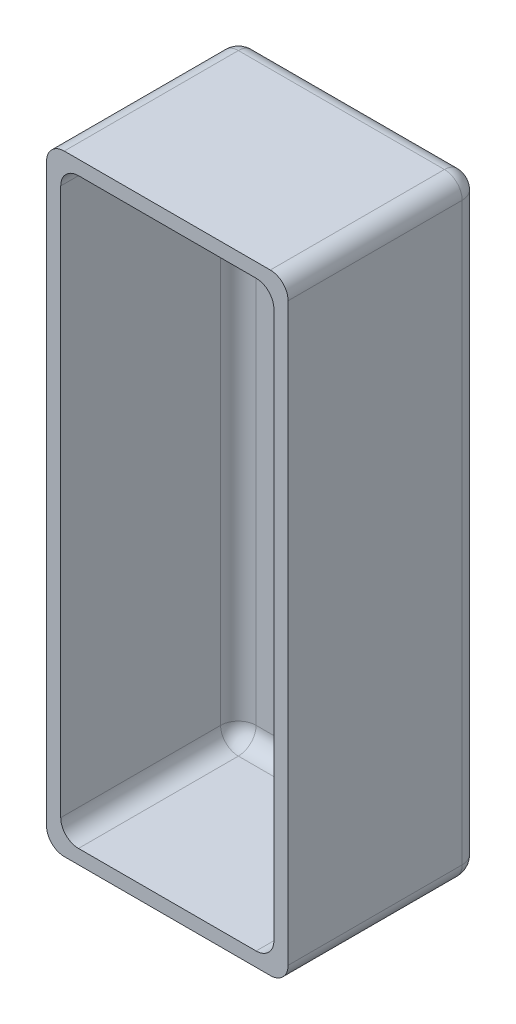
ISO-10303-21;
HEADER;
FILE_DESCRIPTION(('STEP AP214'),'2;1');
FILE_NAME('part.step','',(''),(''),'','','');
FILE_SCHEMA(('AUTOMOTIVE_DESIGN { 1 0 10303 214 1 1 1 1 }'));
ENDSEC;
DATA;
#1=APPLICATION_CONTEXT('core data for automotive mechanical design processes');
#2=APPLICATION_PROTOCOL_DEFINITION('international standard','automotive_design',2000,#1);
#3=PRODUCT_CONTEXT('',#1,'mechanical');
#4=PRODUCT('Part','Part','',(#3));
#5=PRODUCT_RELATED_PRODUCT_CATEGORY('part','',(#4));
#6=PRODUCT_DEFINITION_FORMATION('','',#4);
#7=PRODUCT_DEFINITION_CONTEXT('part definition',#1,'design');
#8=PRODUCT_DEFINITION('design','',#6,#7);
#9=PRODUCT_DEFINITION_SHAPE('','',#8);
#10=(LENGTH_UNIT() NAMED_UNIT(*) SI_UNIT(.MILLI.,.METRE.));
#11=(NAMED_UNIT(*) PLANE_ANGLE_UNIT() SI_UNIT($,.RADIAN.));
#12=(NAMED_UNIT(*) SI_UNIT($,.STERADIAN.) SOLID_ANGLE_UNIT());
#13=UNCERTAINTY_MEASURE_WITH_UNIT(LENGTH_MEASURE(1.E-05),#10,'distance_accuracy_value','');
#14=(GEOMETRIC_REPRESENTATION_CONTEXT(3) GLOBAL_UNCERTAINTY_ASSIGNED_CONTEXT((#13)) GLOBAL_UNIT_ASSIGNED_CONTEXT((#10,
#11,#12)) REPRESENTATION_CONTEXT('',''));
#15=CARTESIAN_POINT('',(0.,0.,0.));
#16=DIRECTION('',(0.,0.,1.));
#17=DIRECTION('',(1.,0.,0.));
#18=AXIS2_PLACEMENT_3D('',#15,#16,#17);
#19=CARTESIAN_POINT('',(-17.,-41.,25.));
#20=DIRECTION('',(1.,0.,0.));
#21=DIRECTION('',(0.,0.,-1.));
#22=AXIS2_PLACEMENT_3D('',#19,#20,#21);
#23=PLANE('',#22);
#24=DIRECTION('',(0.,-1.,0.));
#25=VECTOR('',#24,1.);
#26=CARTESIAN_POINT('',(-17.,-41.,25.));
#27=LINE('',#26,#25);
#28=CARTESIAN_POINT('',(-17.,40.5,25.));
#29=VERTEX_POINT('',#28);
#30=CARTESIAN_POINT('',(-17.,-40.5,25.));
#31=VERTEX_POINT('',#30);
#32=EDGE_CURVE('E297',#29,#31,#27,.T.);
#33=ORIENTED_EDGE('',*,*,#32,.F.);
#34=DIRECTION('',(0.,0.,-1.));
#35=VECTOR('',#34,1.);
#36=CARTESIAN_POINT('',(-17.,40.5,25.));
#37=LINE('',#36,#35);
#38=CARTESIAN_POINT('',(-17.,40.5,0.5));
#39=VERTEX_POINT('',#38);
#40=EDGE_CURVE('E304',#29,#39,#37,.T.);
#41=ORIENTED_EDGE('',*,*,#40,.T.);
#42=DIRECTION('',(0.,-1.,0.));
#43=VECTOR('',#42,1.);
#44=CARTESIAN_POINT('',(-17.,-41.,0.5));
#45=LINE('',#44,#43);
#46=CARTESIAN_POINT('',(-17.,-40.5,0.5));
#47=VERTEX_POINT('',#46);
#48=EDGE_CURVE('E314',#39,#47,#45,.T.);
#49=ORIENTED_EDGE('',*,*,#48,.T.);
#50=DIRECTION('',(0.,0.,-1.));
#51=VECTOR('',#50,1.);
#52=CARTESIAN_POINT('',(-17.,-40.5,25.));
#53=LINE('',#52,#51);
#54=EDGE_CURVE('E307',#47,#31,#53,.F.);
#55=ORIENTED_EDGE('',*,*,#54,.T.);
#56=EDGE_LOOP('',(#33,#41,#49,#55));
#57=FACE_BOUND('',#56,.T.);
#58=ADVANCED_FACE('F33',(#57),#23,.F.);
#59=CARTESIAN_POINT('',(15.,-43.,25.));
#60=DIRECTION('',(0.,1.,0.));
#61=DIRECTION('',(-1.,0.,0.));
#62=AXIS2_PLACEMENT_3D('',#59,#60,#61);
#63=PLANE('',#62);
#64=DIRECTION('',(1.,0.,0.));
#65=VECTOR('',#64,1.);
#66=CARTESIAN_POINT('',(15.,-43.,25.));
#67=LINE('',#66,#65);
#68=CARTESIAN_POINT('',(-14.5,-43.,25.));
#69=VERTEX_POINT('',#68);
#70=CARTESIAN_POINT('',(14.5,-43.,25.));
#71=VERTEX_POINT('',#70);
#72=EDGE_CURVE('E308',#69,#71,#67,.T.);
#73=ORIENTED_EDGE('',*,*,#72,.F.);
#74=DIRECTION('',(0.,0.,-1.));
#75=VECTOR('',#74,1.);
#76=CARTESIAN_POINT('',(-14.5,-43.,25.));
#77=LINE('',#76,#75);
#78=CARTESIAN_POINT('',(-14.5,-43.,0.5));
#79=VERTEX_POINT('',#78);
#80=EDGE_CURVE('E283',#69,#79,#77,.T.);
#81=ORIENTED_EDGE('',*,*,#80,.T.);
#82=DIRECTION('',(1.,0.,0.));
#83=VECTOR('',#82,1.);
#84=CARTESIAN_POINT('',(15.,-43.,0.5));
#85=LINE('',#84,#83);
#86=CARTESIAN_POINT('',(14.5,-43.,0.5));
#87=VERTEX_POINT('',#86);
#88=EDGE_CURVE('E316',#79,#87,#85,.T.);
#89=ORIENTED_EDGE('',*,*,#88,.T.);
#90=DIRECTION('',(0.,0.,-1.));
#91=VECTOR('',#90,1.);
#92=CARTESIAN_POINT('',(14.5,-43.,25.));
#93=LINE('',#92,#91);
#94=EDGE_CURVE('E313',#87,#71,#93,.F.);
#95=ORIENTED_EDGE('',*,*,#94,.T.);
#96=EDGE_LOOP('',(#73,#81,#89,#95));
#97=FACE_BOUND('',#96,.T.);
#98=ADVANCED_FACE('F324',(#97),#63,.F.);
#99=CARTESIAN_POINT('',(17.,-41.,25.));
#100=DIRECTION('',(-1.,0.,0.));
#101=DIRECTION('',(0.,0.,1.));
#102=AXIS2_PLACEMENT_3D('',#99,#100,#101);
#103=PLANE('',#102);
#104=DIRECTION('',(0.,1.,0.));
#105=VECTOR('',#104,1.);
#106=CARTESIAN_POINT('',(17.,-41.,0.5));
#107=LINE('',#106,#105);
#108=CARTESIAN_POINT('',(17.,-40.5,0.5));
#109=VERTEX_POINT('',#108);
#110=CARTESIAN_POINT('',(17.,40.5,0.5));
#111=VERTEX_POINT('',#110);
#112=EDGE_CURVE('E50',#109,#111,#107,.T.);
#113=ORIENTED_EDGE('',*,*,#112,.T.);
#114=DIRECTION('',(0.,0.,-1.));
#115=VECTOR('',#114,1.);
#116=CARTESIAN_POINT('',(17.,40.5,25.));
#117=LINE('',#116,#115);
#118=CARTESIAN_POINT('',(17.,40.5,25.));
#119=VERTEX_POINT('',#118);
#120=EDGE_CURVE('E279',#111,#119,#117,.F.);
#121=ORIENTED_EDGE('',*,*,#120,.T.);
#122=DIRECTION('',(0.,1.,0.));
#123=VECTOR('',#122,1.);
#124=CARTESIAN_POINT('',(17.,-41.,25.));
#125=LINE('',#124,#123);
#126=CARTESIAN_POINT('',(17.,-40.5,25.));
#127=VERTEX_POINT('',#126);
#128=EDGE_CURVE('E386',#127,#119,#125,.T.);
#129=ORIENTED_EDGE('',*,*,#128,.F.);
#130=DIRECTION('',(0.,0.,-1.));
#131=VECTOR('',#130,1.);
#132=CARTESIAN_POINT('',(17.,-40.5,25.));
#133=LINE('',#132,#131);
#134=EDGE_CURVE('E55',#127,#109,#133,.T.);
#135=ORIENTED_EDGE('',*,*,#134,.T.);
#136=EDGE_LOOP('',(#113,#121,#129,#135));
#137=FACE_BOUND('',#136,.T.);
#138=ADVANCED_FACE('F463',(#137),#103,.F.);
#139=CARTESIAN_POINT('',(15.,43.,25.));
#140=DIRECTION('',(0.,-1.,0.));
#141=DIRECTION('',(1.,0.,0.));
#142=AXIS2_PLACEMENT_3D('',#139,#140,#141);
#143=PLANE('',#142);
#144=DIRECTION('',(-1.,0.,0.));
#145=VECTOR('',#144,1.);
#146=CARTESIAN_POINT('',(15.,43.,0.5));
#147=LINE('',#146,#145);
#148=CARTESIAN_POINT('',(14.5,43.,0.5));
#149=VERTEX_POINT('',#148);
#150=CARTESIAN_POINT('',(-14.5,43.,0.5));
#151=VERTEX_POINT('',#150);
#152=EDGE_CURVE('E351',#149,#151,#147,.T.);
#153=ORIENTED_EDGE('',*,*,#152,.T.);
#154=DIRECTION('',(0.,0.,-1.));
#155=VECTOR('',#154,1.);
#156=CARTESIAN_POINT('',(-14.5,43.,25.));
#157=LINE('',#156,#155);
#158=CARTESIAN_POINT('',(-14.5,43.,25.));
#159=VERTEX_POINT('',#158);
#160=EDGE_CURVE('E349',#151,#159,#157,.F.);
#161=ORIENTED_EDGE('',*,*,#160,.T.);
#162=DIRECTION('',(-1.,0.,0.));
#163=VECTOR('',#162,1.);
#164=CARTESIAN_POINT('',(15.,43.,25.));
#165=LINE('',#164,#163);
#166=CARTESIAN_POINT('',(14.5,43.,25.));
#167=VERTEX_POINT('',#166);
#168=EDGE_CURVE('E183',#167,#159,#165,.T.);
#169=ORIENTED_EDGE('',*,*,#168,.F.);
#170=DIRECTION('',(0.,0.,-1.));
#171=VECTOR('',#170,1.);
#172=CARTESIAN_POINT('',(14.5,43.,25.));
#173=LINE('',#172,#171);
#174=EDGE_CURVE('E354',#167,#149,#173,.T.);
#175=ORIENTED_EDGE('',*,*,#174,.T.);
#176=EDGE_LOOP('',(#153,#161,#169,#175));
#177=FACE_BOUND('',#176,.T.);
#178=ADVANCED_FACE('F470',(#177),#143,.F.);
#179=CARTESIAN_POINT('',(0.,0.,25.));
#180=DIRECTION('',(0.,0.,1.));
#181=DIRECTION('',(1.,0.,0.));
#182=AXIS2_PLACEMENT_3D('',#179,#180,#181);
#183=PLANE('',#182);
#184=DIRECTION('',(0.,-1.,0.));
#185=VECTOR('',#184,1.);
#186=CARTESIAN_POINT('',(-15.,-41.,25.));
#187=LINE('',#186,#185);
#188=CARTESIAN_POINT('',(-15.,38.5,25.));
#189=VERTEX_POINT('',#188);
#190=CARTESIAN_POINT('',(-15.,-38.5,25.));
#191=VERTEX_POINT('',#190);
#192=EDGE_CURVE('E175',#189,#191,#187,.T.);
#193=ORIENTED_EDGE('',*,*,#192,.F.);
#194=CARTESIAN_POINT('',(-12.5,38.5,25.));
#195=DIRECTION('',(0.,0.,1.));
#196=DIRECTION('',(1.,0.,0.));
#197=AXIS2_PLACEMENT_3D('',#194,#195,#196);
#198=CIRCLE('',#197,2.5);
#199=CARTESIAN_POINT('',(-12.5,41.,25.));
#200=VERTEX_POINT('',#199);
#201=EDGE_CURVE('E42',#189,#200,#198,.F.);
#202=ORIENTED_EDGE('',*,*,#201,.T.);
#203=DIRECTION('',(-1.,0.,0.));
#204=VECTOR('',#203,1.);
#205=CARTESIAN_POINT('',(15.,41.,25.));
#206=LINE('',#205,#204);
#207=CARTESIAN_POINT('',(12.5,41.,25.));
#208=VERTEX_POINT('',#207);
#209=EDGE_CURVE('E309',#208,#200,#206,.T.);
#210=ORIENTED_EDGE('',*,*,#209,.F.);
#211=CARTESIAN_POINT('',(12.5,38.5,25.));
#212=DIRECTION('',(0.,0.,1.));
#213=DIRECTION('',(1.,0.,0.));
#214=AXIS2_PLACEMENT_3D('',#211,#212,#213);
#215=CIRCLE('',#214,2.5);
#216=CARTESIAN_POINT('',(15.,38.5,25.));
#217=VERTEX_POINT('',#216);
#218=EDGE_CURVE('E11',#208,#217,#215,.F.);
#219=ORIENTED_EDGE('',*,*,#218,.T.);
#220=DIRECTION('',(0.,1.,0.));
#221=VECTOR('',#220,1.);
#222=CARTESIAN_POINT('',(15.,-41.,25.));
#223=LINE('',#222,#221);
#224=CARTESIAN_POINT('',(15.,-38.5,25.));
#225=VERTEX_POINT('',#224);
#226=EDGE_CURVE('E391',#225,#217,#223,.T.);
#227=ORIENTED_EDGE('',*,*,#226,.F.);
#228=CARTESIAN_POINT('',(12.5,-38.5,25.));
#229=DIRECTION('',(0.,0.,1.));
#230=DIRECTION('',(1.,0.,0.));
#231=AXIS2_PLACEMENT_3D('',#228,#229,#230);
#232=CIRCLE('',#231,2.5);
#233=CARTESIAN_POINT('',(12.5,-41.,25.));
#234=VERTEX_POINT('',#233);
#235=EDGE_CURVE('E199',#225,#234,#232,.F.);
#236=ORIENTED_EDGE('',*,*,#235,.T.);
#237=DIRECTION('',(1.,0.,0.));
#238=VECTOR('',#237,1.);
#239=CARTESIAN_POINT('',(15.,-41.,25.));
#240=LINE('',#239,#238);
#241=CARTESIAN_POINT('',(-12.5,-41.,25.));
#242=VERTEX_POINT('',#241);
#243=EDGE_CURVE('E193',#242,#234,#240,.T.);
#244=ORIENTED_EDGE('',*,*,#243,.F.);
#245=CARTESIAN_POINT('',(-12.5,-38.5,25.));
#246=DIRECTION('',(0.,0.,1.));
#247=DIRECTION('',(1.,0.,0.));
#248=AXIS2_PLACEMENT_3D('',#245,#246,#247);
#249=CIRCLE('',#248,2.5);
#250=EDGE_CURVE('E192',#242,#191,#249,.F.);
#251=ORIENTED_EDGE('',*,*,#250,.T.);
#252=EDGE_LOOP('',(#193,#202,#210,#219,#227,#236,#244,#251));
#253=FACE_BOUND('',#252,.T.);
#254=ORIENTED_EDGE('',*,*,#168,.T.);
#255=CARTESIAN_POINT('',(-14.5,40.5,25.));
#256=DIRECTION('',(0.,0.,1.));
#257=DIRECTION('',(1.,0.,0.));
#258=AXIS2_PLACEMENT_3D('',#255,#256,#257);
#259=CIRCLE('',#258,2.5);
#260=EDGE_CURVE('E292',#159,#29,#259,.T.);
#261=ORIENTED_EDGE('',*,*,#260,.T.);
#262=ORIENTED_EDGE('',*,*,#32,.T.);
#263=CARTESIAN_POINT('',(-14.5,-40.5,25.));
#264=DIRECTION('',(0.,0.,1.));
#265=DIRECTION('',(1.,0.,0.));
#266=AXIS2_PLACEMENT_3D('',#263,#264,#265);
#267=CIRCLE('',#266,2.5);
#268=EDGE_CURVE('E288',#31,#69,#267,.T.);
#269=ORIENTED_EDGE('',*,*,#268,.T.);
#270=ORIENTED_EDGE('',*,*,#72,.T.);
#271=CARTESIAN_POINT('',(14.5,-40.5,25.));
#272=DIRECTION('',(0.,0.,1.));
#273=DIRECTION('',(1.,0.,0.));
#274=AXIS2_PLACEMENT_3D('',#271,#272,#273);
#275=CIRCLE('',#274,2.5);
#276=EDGE_CURVE('E281',#71,#127,#275,.T.);
#277=ORIENTED_EDGE('',*,*,#276,.T.);
#278=ORIENTED_EDGE('',*,*,#128,.T.);
#279=CARTESIAN_POINT('',(14.5,40.5,25.));
#280=DIRECTION('',(0.,0.,1.));
#281=DIRECTION('',(1.,0.,0.));
#282=AXIS2_PLACEMENT_3D('',#279,#280,#281);
#283=CIRCLE('',#282,2.5);
#284=EDGE_CURVE('E290',#119,#167,#283,.T.);
#285=ORIENTED_EDGE('',*,*,#284,.T.);
#286=EDGE_LOOP('',(#254,#261,#262,#269,#270,#277,#278,#285));
#287=FACE_BOUND('',#286,.T.);
#288=ADVANCED_FACE('F186',(#253,#287),#183,.T.);
#289=CARTESIAN_POINT('',(0.,0.,-2.));
#290=DIRECTION('',(0.,0.,1.));
#291=DIRECTION('',(1.,0.,0.));
#292=AXIS2_PLACEMENT_3D('',#289,#290,#291);
#293=PLANE('',#292);
#294=DIRECTION('',(0.,-1.,0.));
#295=VECTOR('',#294,1.);
#296=CARTESIAN_POINT('',(-14.5,0.,-2.));
#297=LINE('',#296,#295);
#298=CARTESIAN_POINT('',(-14.5,-40.5,-2.));
#299=VERTEX_POINT('',#298);
#300=CARTESIAN_POINT('',(-14.5,40.5,-2.));
#301=VERTEX_POINT('',#300);
#302=EDGE_CURVE('E338',#299,#301,#297,.F.);
#303=ORIENTED_EDGE('',*,*,#302,.T.);
#304=DIRECTION('',(-1.,0.,0.));
#305=VECTOR('',#304,1.);
#306=CARTESIAN_POINT('',(0.,40.5,-2.));
#307=LINE('',#306,#305);
#308=CARTESIAN_POINT('',(14.5,40.5,-2.));
#309=VERTEX_POINT('',#308);
#310=EDGE_CURVE('E342',#301,#309,#307,.F.);
#311=ORIENTED_EDGE('',*,*,#310,.T.);
#312=DIRECTION('',(0.,1.,0.));
#313=VECTOR('',#312,1.);
#314=CARTESIAN_POINT('',(14.5,0.,-2.));
#315=LINE('',#314,#313);
#316=CARTESIAN_POINT('',(14.5,-40.5,-2.));
#317=VERTEX_POINT('',#316);
#318=EDGE_CURVE('E277',#309,#317,#315,.F.);
#319=ORIENTED_EDGE('',*,*,#318,.T.);
#320=DIRECTION('',(1.,0.,0.));
#321=VECTOR('',#320,1.);
#322=CARTESIAN_POINT('',(0.,-40.5,-2.));
#323=LINE('',#322,#321);
#324=EDGE_CURVE('E343',#317,#299,#323,.F.);
#325=ORIENTED_EDGE('',*,*,#324,.T.);
#326=EDGE_LOOP('',(#303,#311,#319,#325));
#327=FACE_BOUND('',#326,.T.);
#328=ADVANCED_FACE('F474',(#327),#293,.F.);
#329=CARTESIAN_POINT('',(-15.,-41.,25.));
#330=DIRECTION('',(1.,0.,0.));
#331=DIRECTION('',(0.,0.,-1.));
#332=AXIS2_PLACEMENT_3D('',#329,#330,#331);
#333=PLANE('',#332);
#334=ORIENTED_EDGE('',*,*,#192,.T.);
#335=DIRECTION('',(0.,0.,-1.));
#336=VECTOR('',#335,1.);
#337=CARTESIAN_POINT('',(-15.,-38.5,0.));
#338=LINE('',#337,#336);
#339=CARTESIAN_POINT('',(-15.,-38.5,2.5));
#340=VERTEX_POINT('',#339);
#341=EDGE_CURVE('E382',#191,#340,#338,.T.);
#342=ORIENTED_EDGE('',*,*,#341,.T.);
#343=DIRECTION('',(0.,-1.,0.));
#344=VECTOR('',#343,1.);
#345=CARTESIAN_POINT('',(-15.,41.,2.5));
#346=LINE('',#345,#344);
#347=CARTESIAN_POINT('',(-15.,38.5,2.5));
#348=VERTEX_POINT('',#347);
#349=EDGE_CURVE('E178',#340,#348,#346,.F.);
#350=ORIENTED_EDGE('',*,*,#349,.T.);
#351=DIRECTION('',(0.,0.,-1.));
#352=VECTOR('',#351,1.);
#353=CARTESIAN_POINT('',(-15.,38.5,25.));
#354=LINE('',#353,#352);
#355=EDGE_CURVE('E171',#348,#189,#354,.F.);
#356=ORIENTED_EDGE('',*,*,#355,.T.);
#357=EDGE_LOOP('',(#334,#342,#350,#356));
#358=FACE_BOUND('',#357,.T.);
#359=ADVANCED_FACE('F173',(#358),#333,.T.);
#360=CARTESIAN_POINT('',(15.,-41.,25.));
#361=DIRECTION('',(0.,1.,0.));
#362=DIRECTION('',(-1.,0.,0.));
#363=AXIS2_PLACEMENT_3D('',#360,#361,#362);
#364=PLANE('',#363);
#365=DIRECTION('',(1.,0.,0.));
#366=VECTOR('',#365,1.);
#367=CARTESIAN_POINT('',(-15.,-41.,2.5));
#368=LINE('',#367,#366);
#369=CARTESIAN_POINT('',(12.5,-41.,2.5));
#370=VERTEX_POINT('',#369);
#371=CARTESIAN_POINT('',(-12.5,-41.,2.5));
#372=VERTEX_POINT('',#371);
#373=EDGE_CURVE('E378',#370,#372,#368,.F.);
#374=ORIENTED_EDGE('',*,*,#373,.T.);
#375=DIRECTION('',(0.,0.,-1.));
#376=VECTOR('',#375,1.);
#377=CARTESIAN_POINT('',(-12.5,-41.,25.));
#378=LINE('',#377,#376);
#379=EDGE_CURVE('E376',#372,#242,#378,.F.);
#380=ORIENTED_EDGE('',*,*,#379,.T.);
#381=ORIENTED_EDGE('',*,*,#243,.T.);
#382=DIRECTION('',(0.,0.,-1.));
#383=VECTOR('',#382,1.);
#384=CARTESIAN_POINT('',(12.5,-41.,0.));
#385=LINE('',#384,#383);
#386=EDGE_CURVE('E380',#234,#370,#385,.T.);
#387=ORIENTED_EDGE('',*,*,#386,.T.);
#388=EDGE_LOOP('',(#374,#380,#381,#387));
#389=FACE_BOUND('',#388,.T.);
#390=ADVANCED_FACE('F397',(#389),#364,.T.);
#391=CARTESIAN_POINT('',(15.,-41.,25.));
#392=DIRECTION('',(-1.,0.,0.));
#393=DIRECTION('',(0.,0.,1.));
#394=AXIS2_PLACEMENT_3D('',#391,#392,#393);
#395=PLANE('',#394);
#396=DIRECTION('',(0.,1.,0.));
#397=VECTOR('',#396,1.);
#398=CARTESIAN_POINT('',(15.,-41.,2.5));
#399=LINE('',#398,#397);
#400=CARTESIAN_POINT('',(15.,38.5,2.5));
#401=VERTEX_POINT('',#400);
#402=CARTESIAN_POINT('',(15.,-38.5,2.5));
#403=VERTEX_POINT('',#402);
#404=EDGE_CURVE('E363',#401,#403,#399,.F.);
#405=ORIENTED_EDGE('',*,*,#404,.T.);
#406=DIRECTION('',(0.,0.,-1.));
#407=VECTOR('',#406,1.);
#408=CARTESIAN_POINT('',(15.,-38.5,25.));
#409=LINE('',#408,#407);
#410=EDGE_CURVE('E361',#403,#225,#409,.F.);
#411=ORIENTED_EDGE('',*,*,#410,.T.);
#412=ORIENTED_EDGE('',*,*,#226,.T.);
#413=DIRECTION('',(0.,0.,-1.));
#414=VECTOR('',#413,1.);
#415=CARTESIAN_POINT('',(15.,38.5,0.));
#416=LINE('',#415,#414);
#417=EDGE_CURVE('E365',#217,#401,#416,.T.);
#418=ORIENTED_EDGE('',*,*,#417,.T.);
#419=EDGE_LOOP('',(#405,#411,#412,#418));
#420=FACE_BOUND('',#419,.T.);
#421=ADVANCED_FACE('F447',(#420),#395,.T.);
#422=CARTESIAN_POINT('',(15.,41.,25.));
#423=DIRECTION('',(0.,-1.,0.));
#424=DIRECTION('',(1.,0.,0.));
#425=AXIS2_PLACEMENT_3D('',#422,#423,#424);
#426=PLANE('',#425);
#427=ORIENTED_EDGE('',*,*,#209,.T.);
#428=DIRECTION('',(0.,0.,-1.));
#429=VECTOR('',#428,1.);
#430=CARTESIAN_POINT('',(-12.5,41.,0.));
#431=LINE('',#430,#429);
#432=CARTESIAN_POINT('',(-12.5,41.,2.5));
#433=VERTEX_POINT('',#432);
#434=EDGE_CURVE('E198',#200,#433,#431,.T.);
#435=ORIENTED_EDGE('',*,*,#434,.T.);
#436=DIRECTION('',(-1.,0.,0.));
#437=VECTOR('',#436,1.);
#438=CARTESIAN_POINT('',(15.,41.,2.5));
#439=LINE('',#438,#437);
#440=CARTESIAN_POINT('',(12.5,41.,2.5));
#441=VERTEX_POINT('',#440);
#442=EDGE_CURVE('E357',#433,#441,#439,.F.);
#443=ORIENTED_EDGE('',*,*,#442,.T.);
#444=DIRECTION('',(0.,0.,-1.));
#445=VECTOR('',#444,1.);
#446=CARTESIAN_POINT('',(12.5,41.,25.));
#447=LINE('',#446,#445);
#448=EDGE_CURVE('E359',#441,#208,#447,.F.);
#449=ORIENTED_EDGE('',*,*,#448,.T.);
#450=EDGE_LOOP('',(#427,#435,#443,#449));
#451=FACE_BOUND('',#450,.T.);
#452=ADVANCED_FACE('F434',(#451),#426,.T.);
#453=CARTESIAN_POINT('',(0.,0.,0.));
#454=DIRECTION('',(0.,0.,1.));
#455=DIRECTION('',(1.,0.,0.));
#456=AXIS2_PLACEMENT_3D('',#453,#454,#455);
#457=PLANE('',#456);
#458=DIRECTION('',(0.,-1.,0.));
#459=VECTOR('',#458,1.);
#460=CARTESIAN_POINT('',(-12.5,-41.,0.));
#461=LINE('',#460,#459);
#462=CARTESIAN_POINT('',(-12.5,38.5,0.));
#463=VERTEX_POINT('',#462);
#464=CARTESIAN_POINT('',(-12.5,-38.5,0.));
#465=VERTEX_POINT('',#464);
#466=EDGE_CURVE('E370',#463,#465,#461,.T.);
#467=ORIENTED_EDGE('',*,*,#466,.T.);
#468=DIRECTION('',(1.,0.,0.));
#469=VECTOR('',#468,1.);
#470=CARTESIAN_POINT('',(15.,-38.5,0.));
#471=LINE('',#470,#469);
#472=CARTESIAN_POINT('',(12.5,-38.5,0.));
#473=VERTEX_POINT('',#472);
#474=EDGE_CURVE('E367',#465,#473,#471,.T.);
#475=ORIENTED_EDGE('',*,*,#474,.T.);
#476=DIRECTION('',(0.,1.,0.));
#477=VECTOR('',#476,1.);
#478=CARTESIAN_POINT('',(12.5,41.,0.));
#479=LINE('',#478,#477);
#480=CARTESIAN_POINT('',(12.5,38.5,0.));
#481=VERTEX_POINT('',#480);
#482=EDGE_CURVE('E372',#473,#481,#479,.T.);
#483=ORIENTED_EDGE('',*,*,#482,.T.);
#484=DIRECTION('',(-1.,0.,0.));
#485=VECTOR('',#484,1.);
#486=CARTESIAN_POINT('',(-15.,38.5,0.));
#487=LINE('',#486,#485);
#488=EDGE_CURVE('E374',#481,#463,#487,.T.);
#489=ORIENTED_EDGE('',*,*,#488,.T.);
#490=EDGE_LOOP('',(#467,#475,#483,#489));
#491=FACE_BOUND('',#490,.T.);
#492=ADVANCED_FACE('F455',(#491),#457,.T.);
#493=CARTESIAN_POINT('',(12.5,38.5,25.));
#494=DIRECTION('',(0.,0.,1.));
#495=DIRECTION('',(1.,0.,0.));
#496=AXIS2_PLACEMENT_3D('',#493,#494,#495);
#497=CYLINDRICAL_SURFACE('',#496,2.5);
#498=CARTESIAN_POINT('',(12.5,38.5,2.5));
#499=DIRECTION('',(0.,0.,1.));
#500=DIRECTION('',(1.,0.,0.));
#501=AXIS2_PLACEMENT_3D('',#498,#499,#500);
#502=CIRCLE('',#501,2.5);
#503=EDGE_CURVE('E194',#401,#441,#502,.T.);
#504=ORIENTED_EDGE('',*,*,#503,.F.);
#505=ORIENTED_EDGE('',*,*,#417,.F.);
#506=ORIENTED_EDGE('',*,*,#218,.F.);
#507=ORIENTED_EDGE('',*,*,#448,.F.);
#508=EDGE_LOOP('',(#504,#505,#506,#507));
#509=FACE_BOUND('',#508,.T.);
#510=ADVANCED_FACE('F438',(#509),#497,.F.);
#511=CARTESIAN_POINT('',(12.5,38.5,2.5));
#512=DIRECTION('',(0.,0.,1.));
#513=DIRECTION('',(1.,0.,0.));
#514=AXIS2_PLACEMENT_3D('',#511,#512,#513);
#515=SPHERICAL_SURFACE('',#514,2.5);
#516=CARTESIAN_POINT('',(12.5,38.5,2.5));
#517=DIRECTION('',(0.,-1.,0.));
#518=DIRECTION('',(1.,0.,0.));
#519=AXIS2_PLACEMENT_3D('',#516,#517,#518);
#520=CIRCLE('',#519,2.5);
#521=EDGE_CURVE('E228',#401,#481,#520,.F.);
#522=ORIENTED_EDGE('',*,*,#521,.F.);
#523=ORIENTED_EDGE('',*,*,#503,.T.);
#524=CARTESIAN_POINT('',(12.5,38.5,2.5));
#525=DIRECTION('',(-1.,0.,0.));
#526=DIRECTION('',(0.,0.,1.));
#527=AXIS2_PLACEMENT_3D('',#524,#525,#526);
#528=CIRCLE('',#527,2.5);
#529=EDGE_CURVE('E231',#481,#441,#528,.F.);
#530=ORIENTED_EDGE('',*,*,#529,.F.);
#531=EDGE_LOOP('',(#522,#523,#530));
#532=FACE_BOUND('',#531,.T.);
#533=ADVANCED_FACE('F442',(#532),#515,.F.);
#534=CARTESIAN_POINT('',(-12.5,38.5,25.));
#535=DIRECTION('',(0.,0.,1.));
#536=DIRECTION('',(1.,0.,0.));
#537=AXIS2_PLACEMENT_3D('',#534,#535,#536);
#538=CYLINDRICAL_SURFACE('',#537,2.5);
#539=ORIENTED_EDGE('',*,*,#201,.F.);
#540=ORIENTED_EDGE('',*,*,#355,.F.);
#541=CARTESIAN_POINT('',(-12.5,38.5,2.5));
#542=DIRECTION('',(0.,0.,1.));
#543=DIRECTION('',(1.,0.,0.));
#544=AXIS2_PLACEMENT_3D('',#541,#542,#543);
#545=CIRCLE('',#544,2.5);
#546=EDGE_CURVE('E226',#433,#348,#545,.T.);
#547=ORIENTED_EDGE('',*,*,#546,.F.);
#548=ORIENTED_EDGE('',*,*,#434,.F.);
#549=EDGE_LOOP('',(#539,#540,#547,#548));
#550=FACE_BOUND('',#549,.T.);
#551=ADVANCED_FACE('F197',(#550),#538,.F.);
#552=CARTESIAN_POINT('',(0.,38.5,2.5));
#553=DIRECTION('',(1.,0.,0.));
#554=DIRECTION('',(0.,1.,0.));
#555=AXIS2_PLACEMENT_3D('',#552,#553,#554);
#556=CYLINDRICAL_SURFACE('',#555,2.5);
#557=ORIENTED_EDGE('',*,*,#529,.T.);
#558=ORIENTED_EDGE('',*,*,#442,.F.);
#559=CARTESIAN_POINT('',(-12.5,38.5,2.5));
#560=DIRECTION('',(1.,0.,0.));
#561=DIRECTION('',(0.,1.,0.));
#562=AXIS2_PLACEMENT_3D('',#559,#560,#561);
#563=CIRCLE('',#562,2.5);
#564=EDGE_CURVE('E223',#463,#433,#563,.T.);
#565=ORIENTED_EDGE('',*,*,#564,.F.);
#566=ORIENTED_EDGE('',*,*,#488,.F.);
#567=EDGE_LOOP('',(#557,#558,#565,#566));
#568=FACE_BOUND('',#567,.T.);
#569=ADVANCED_FACE('F430',(#568),#556,.F.);
#570=CARTESIAN_POINT('',(12.5,0.,2.5));
#571=DIRECTION('',(0.,-1.,0.));
#572=DIRECTION('',(0.,0.,-1.));
#573=AXIS2_PLACEMENT_3D('',#570,#571,#572);
#574=CYLINDRICAL_SURFACE('',#573,2.5);
#575=ORIENTED_EDGE('',*,*,#521,.T.);
#576=ORIENTED_EDGE('',*,*,#482,.F.);
#577=CARTESIAN_POINT('',(12.5,-38.5,2.5));
#578=DIRECTION('',(0.,1.,0.));
#579=DIRECTION('',(0.,0.,1.));
#580=AXIS2_PLACEMENT_3D('',#577,#578,#579);
#581=CIRCLE('',#580,2.5);
#582=EDGE_CURVE('E220',#403,#473,#581,.T.);
#583=ORIENTED_EDGE('',*,*,#582,.F.);
#584=ORIENTED_EDGE('',*,*,#404,.F.);
#585=EDGE_LOOP('',(#575,#576,#583,#584));
#586=FACE_BOUND('',#585,.T.);
#587=ADVANCED_FACE('F445',(#586),#574,.F.);
#588=CARTESIAN_POINT('',(12.5,-38.5,25.));
#589=DIRECTION('',(0.,0.,1.));
#590=DIRECTION('',(1.,0.,0.));
#591=AXIS2_PLACEMENT_3D('',#588,#589,#590);
#592=CYLINDRICAL_SURFACE('',#591,2.5);
#593=ORIENTED_EDGE('',*,*,#235,.F.);
#594=ORIENTED_EDGE('',*,*,#410,.F.);
#595=CARTESIAN_POINT('',(12.5,-38.5,2.5));
#596=DIRECTION('',(0.,0.,1.));
#597=DIRECTION('',(1.,0.,0.));
#598=AXIS2_PLACEMENT_3D('',#595,#596,#597);
#599=CIRCLE('',#598,2.5);
#600=EDGE_CURVE('E217',#370,#403,#599,.T.);
#601=ORIENTED_EDGE('',*,*,#600,.F.);
#602=ORIENTED_EDGE('',*,*,#386,.F.);
#603=EDGE_LOOP('',(#593,#594,#601,#602));
#604=FACE_BOUND('',#603,.T.);
#605=ADVANCED_FACE('F402',(#604),#592,.F.);
#606=CARTESIAN_POINT('',(-12.5,38.5,2.5));
#607=DIRECTION('',(0.,0.,1.));
#608=DIRECTION('',(1.,0.,0.));
#609=AXIS2_PLACEMENT_3D('',#606,#607,#608);
#610=SPHERICAL_SURFACE('',#609,2.5);
#611=ORIENTED_EDGE('',*,*,#564,.T.);
#612=ORIENTED_EDGE('',*,*,#546,.T.);
#613=CARTESIAN_POINT('',(-12.5,38.5,2.5));
#614=DIRECTION('',(0.,-1.,0.));
#615=DIRECTION('',(0.,0.,-1.));
#616=AXIS2_PLACEMENT_3D('',#613,#614,#615);
#617=CIRCLE('',#616,2.5);
#618=EDGE_CURVE('E214',#463,#348,#617,.F.);
#619=ORIENTED_EDGE('',*,*,#618,.F.);
#620=EDGE_LOOP('',(#611,#612,#619));
#621=FACE_BOUND('',#620,.T.);
#622=ADVANCED_FACE('F425',(#621),#610,.F.);
#623=CARTESIAN_POINT('',(12.5,-38.5,2.5));
#624=DIRECTION('',(0.,0.,1.));
#625=DIRECTION('',(1.,0.,0.));
#626=AXIS2_PLACEMENT_3D('',#623,#624,#625);
#627=SPHERICAL_SURFACE('',#626,2.5);
#628=ORIENTED_EDGE('',*,*,#600,.T.);
#629=ORIENTED_EDGE('',*,*,#582,.T.);
#630=CARTESIAN_POINT('',(12.5,-38.5,2.5));
#631=DIRECTION('',(-1.,0.,0.));
#632=DIRECTION('',(0.,0.,1.));
#633=AXIS2_PLACEMENT_3D('',#630,#631,#632);
#634=CIRCLE('',#633,2.5);
#635=EDGE_CURVE('E212',#370,#473,#634,.F.);
#636=ORIENTED_EDGE('',*,*,#635,.F.);
#637=EDGE_LOOP('',(#628,#629,#636));
#638=FACE_BOUND('',#637,.T.);
#639=ADVANCED_FACE('F408',(#638),#627,.F.);
#640=CARTESIAN_POINT('',(-12.5,0.,2.5));
#641=DIRECTION('',(0.,1.,0.));
#642=DIRECTION('',(0.,0.,1.));
#643=AXIS2_PLACEMENT_3D('',#640,#641,#642);
#644=CYLINDRICAL_SURFACE('',#643,2.5);
#645=ORIENTED_EDGE('',*,*,#618,.T.);
#646=ORIENTED_EDGE('',*,*,#349,.F.);
#647=CARTESIAN_POINT('',(-12.5,-38.5,2.5));
#648=DIRECTION('',(0.,1.,0.));
#649=DIRECTION('',(0.,0.,1.));
#650=AXIS2_PLACEMENT_3D('',#647,#648,#649);
#651=CIRCLE('',#650,2.5);
#652=EDGE_CURVE('E209',#465,#340,#651,.T.);
#653=ORIENTED_EDGE('',*,*,#652,.F.);
#654=ORIENTED_EDGE('',*,*,#466,.F.);
#655=EDGE_LOOP('',(#645,#646,#653,#654));
#656=FACE_BOUND('',#655,.T.);
#657=ADVANCED_FACE('F422',(#656),#644,.F.);
#658=CARTESIAN_POINT('',(0.,-38.5,2.5));
#659=DIRECTION('',(-1.,0.,0.));
#660=DIRECTION('',(0.,-1.,0.));
#661=AXIS2_PLACEMENT_3D('',#658,#659,#660);
#662=CYLINDRICAL_SURFACE('',#661,2.5);
#663=ORIENTED_EDGE('',*,*,#635,.T.);
#664=ORIENTED_EDGE('',*,*,#474,.F.);
#665=CARTESIAN_POINT('',(-12.5,-38.5,2.5));
#666=DIRECTION('',(1.,0.,0.));
#667=DIRECTION('',(0.,0.,-1.));
#668=AXIS2_PLACEMENT_3D('',#665,#666,#667);
#669=CIRCLE('',#668,2.5);
#670=EDGE_CURVE('E206',#372,#465,#669,.T.);
#671=ORIENTED_EDGE('',*,*,#670,.F.);
#672=ORIENTED_EDGE('',*,*,#373,.F.);
#673=EDGE_LOOP('',(#663,#664,#671,#672));
#674=FACE_BOUND('',#673,.T.);
#675=ADVANCED_FACE('F413',(#674),#662,.F.);
#676=CARTESIAN_POINT('',(-12.5,-38.5,2.5));
#677=DIRECTION('',(0.,0.,1.));
#678=DIRECTION('',(1.,0.,0.));
#679=AXIS2_PLACEMENT_3D('',#676,#677,#678);
#680=SPHERICAL_SURFACE('',#679,2.5);
#681=ORIENTED_EDGE('',*,*,#670,.T.);
#682=ORIENTED_EDGE('',*,*,#652,.T.);
#683=CARTESIAN_POINT('',(-12.5,-38.5,2.5));
#684=DIRECTION('',(0.,0.,1.));
#685=DIRECTION('',(1.,0.,0.));
#686=AXIS2_PLACEMENT_3D('',#683,#684,#685);
#687=CIRCLE('',#686,2.5);
#688=EDGE_CURVE('E204',#372,#340,#687,.F.);
#689=ORIENTED_EDGE('',*,*,#688,.F.);
#690=EDGE_LOOP('',(#681,#682,#689));
#691=FACE_BOUND('',#690,.T.);
#692=ADVANCED_FACE('F419',(#691),#680,.F.);
#693=CARTESIAN_POINT('',(-12.5,-38.5,25.));
#694=DIRECTION('',(0.,0.,1.));
#695=DIRECTION('',(1.,0.,0.));
#696=AXIS2_PLACEMENT_3D('',#693,#694,#695);
#697=CYLINDRICAL_SURFACE('',#696,2.5);
#698=ORIENTED_EDGE('',*,*,#250,.F.);
#699=ORIENTED_EDGE('',*,*,#379,.F.);
#700=ORIENTED_EDGE('',*,*,#688,.T.);
#701=ORIENTED_EDGE('',*,*,#341,.F.);
#702=EDGE_LOOP('',(#698,#699,#700,#701));
#703=FACE_BOUND('',#702,.T.);
#704=ADVANCED_FACE('F418',(#703),#697,.F.);
#705=CARTESIAN_POINT('',(14.5,-40.5,25.));
#706=DIRECTION('',(0.,0.,-1.));
#707=DIRECTION('',(-1.,0.,0.));
#708=AXIS2_PLACEMENT_3D('',#705,#706,#707);
#709=CYLINDRICAL_SURFACE('',#708,2.5);
#710=ORIENTED_EDGE('',*,*,#276,.F.);
#711=ORIENTED_EDGE('',*,*,#94,.F.);
#712=CARTESIAN_POINT('',(14.5,-40.5,0.5));
#713=DIRECTION('',(0.,0.,-1.));
#714=DIRECTION('',(-1.,0.,0.));
#715=AXIS2_PLACEMENT_3D('',#712,#713,#714);
#716=CIRCLE('',#715,2.5);
#717=EDGE_CURVE('E263',#109,#87,#716,.T.);
#718=ORIENTED_EDGE('',*,*,#717,.F.);
#719=ORIENTED_EDGE('',*,*,#134,.F.);
#720=EDGE_LOOP('',(#710,#711,#718,#719));
#721=FACE_BOUND('',#720,.T.);
#722=ADVANCED_FACE('F35',(#721),#709,.T.);
#723=CARTESIAN_POINT('',(-14.5,-40.5,25.));
#724=DIRECTION('',(0.,0.,-1.));
#725=DIRECTION('',(-1.,0.,0.));
#726=AXIS2_PLACEMENT_3D('',#723,#724,#725);
#727=CYLINDRICAL_SURFACE('',#726,2.5);
#728=ORIENTED_EDGE('',*,*,#268,.F.);
#729=ORIENTED_EDGE('',*,*,#54,.F.);
#730=CARTESIAN_POINT('',(-14.5,-40.5,0.5));
#731=DIRECTION('',(0.,0.,-1.));
#732=DIRECTION('',(-1.,0.,0.));
#733=AXIS2_PLACEMENT_3D('',#730,#731,#732);
#734=CIRCLE('',#733,2.5);
#735=EDGE_CURVE('E261',#79,#47,#734,.T.);
#736=ORIENTED_EDGE('',*,*,#735,.F.);
#737=ORIENTED_EDGE('',*,*,#80,.F.);
#738=EDGE_LOOP('',(#728,#729,#736,#737));
#739=FACE_BOUND('',#738,.T.);
#740=ADVANCED_FACE('F332',(#739),#727,.T.);
#741=CARTESIAN_POINT('',(15.,-40.5,0.5));
#742=DIRECTION('',(1.,0.,0.));
#743=DIRECTION('',(0.,1.,0.));
#744=AXIS2_PLACEMENT_3D('',#741,#742,#743);
#745=CYLINDRICAL_SURFACE('',#744,2.5);
#746=CARTESIAN_POINT('',(14.5,-40.5,0.5));
#747=DIRECTION('',(1.,0.,0.));
#748=DIRECTION('',(0.,0.,-1.));
#749=AXIS2_PLACEMENT_3D('',#746,#747,#748);
#750=CIRCLE('',#749,2.5);
#751=EDGE_CURVE('E37',#87,#317,#750,.T.);
#752=ORIENTED_EDGE('',*,*,#751,.F.);
#753=ORIENTED_EDGE('',*,*,#88,.F.);
#754=CARTESIAN_POINT('',(-14.5,-40.5,0.5));
#755=DIRECTION('',(-1.,0.,0.));
#756=DIRECTION('',(0.,0.,1.));
#757=AXIS2_PLACEMENT_3D('',#754,#755,#756);
#758=CIRCLE('',#757,2.5);
#759=EDGE_CURVE('E258',#299,#79,#758,.T.);
#760=ORIENTED_EDGE('',*,*,#759,.F.);
#761=ORIENTED_EDGE('',*,*,#324,.F.);
#762=EDGE_LOOP('',(#752,#753,#760,#761));
#763=FACE_BOUND('',#762,.T.);
#764=ADVANCED_FACE('F330',(#763),#745,.T.);
#765=CARTESIAN_POINT('',(14.5,-40.5,0.5));
#766=DIRECTION('',(0.,0.,1.));
#767=DIRECTION('',(1.,0.,0.));
#768=AXIS2_PLACEMENT_3D('',#765,#766,#767);
#769=SPHERICAL_SURFACE('',#768,2.5);
#770=ORIENTED_EDGE('',*,*,#717,.T.);
#771=ORIENTED_EDGE('',*,*,#751,.T.);
#772=CARTESIAN_POINT('',(14.5,-40.5,0.5));
#773=DIRECTION('',(0.,-1.,0.));
#774=DIRECTION('',(0.,0.,-1.));
#775=AXIS2_PLACEMENT_3D('',#772,#773,#774);
#776=CIRCLE('',#775,2.5);
#777=EDGE_CURVE('E255',#109,#317,#776,.F.);
#778=ORIENTED_EDGE('',*,*,#777,.F.);
#779=EDGE_LOOP('',(#770,#771,#778));
#780=FACE_BOUND('',#779,.T.);
#781=ADVANCED_FACE('F269',(#780),#769,.T.);
#782=CARTESIAN_POINT('',(-14.5,-40.5,0.5));
#783=DIRECTION('',(0.,0.,1.));
#784=DIRECTION('',(1.,0.,0.));
#785=AXIS2_PLACEMENT_3D('',#782,#783,#784);
#786=SPHERICAL_SURFACE('',#785,2.5);
#787=ORIENTED_EDGE('',*,*,#759,.T.);
#788=ORIENTED_EDGE('',*,*,#735,.T.);
#789=CARTESIAN_POINT('',(-14.5,-40.5,0.5));
#790=DIRECTION('',(0.,-1.,0.));
#791=DIRECTION('',(0.,0.,-1.));
#792=AXIS2_PLACEMENT_3D('',#789,#790,#791);
#793=CIRCLE('',#792,2.5);
#794=EDGE_CURVE('E252',#299,#47,#793,.F.);
#795=ORIENTED_EDGE('',*,*,#794,.F.);
#796=EDGE_LOOP('',(#787,#788,#795));
#797=FACE_BOUND('',#796,.T.);
#798=ADVANCED_FACE('F334',(#797),#786,.T.);
#799=CARTESIAN_POINT('',(14.5,-41.,0.5));
#800=DIRECTION('',(0.,1.,0.));
#801=DIRECTION('',(0.,0.,1.));
#802=AXIS2_PLACEMENT_3D('',#799,#800,#801);
#803=CYLINDRICAL_SURFACE('',#802,2.5);
#804=ORIENTED_EDGE('',*,*,#777,.T.);
#805=ORIENTED_EDGE('',*,*,#318,.F.);
#806=CARTESIAN_POINT('',(14.5,40.5,0.5));
#807=DIRECTION('',(0.,1.,0.));
#808=DIRECTION('',(0.,0.,1.));
#809=AXIS2_PLACEMENT_3D('',#806,#807,#808);
#810=CIRCLE('',#809,2.5);
#811=EDGE_CURVE('E249',#111,#309,#810,.T.);
#812=ORIENTED_EDGE('',*,*,#811,.F.);
#813=ORIENTED_EDGE('',*,*,#112,.F.);
#814=EDGE_LOOP('',(#804,#805,#812,#813));
#815=FACE_BOUND('',#814,.T.);
#816=ADVANCED_FACE('F275',(#815),#803,.T.);
#817=CARTESIAN_POINT('',(14.5,40.5,25.));
#818=DIRECTION('',(0.,0.,-1.));
#819=DIRECTION('',(-1.,0.,0.));
#820=AXIS2_PLACEMENT_3D('',#817,#818,#819);
#821=CYLINDRICAL_SURFACE('',#820,2.5);
#822=ORIENTED_EDGE('',*,*,#284,.F.);
#823=ORIENTED_EDGE('',*,*,#120,.F.);
#824=CARTESIAN_POINT('',(14.5,40.5,0.5));
#825=DIRECTION('',(0.,0.,-1.));
#826=DIRECTION('',(-1.,0.,0.));
#827=AXIS2_PLACEMENT_3D('',#824,#825,#826);
#828=CIRCLE('',#827,2.5);
#829=EDGE_CURVE('E246',#149,#111,#828,.T.);
#830=ORIENTED_EDGE('',*,*,#829,.F.);
#831=ORIENTED_EDGE('',*,*,#174,.F.);
#832=EDGE_LOOP('',(#822,#823,#830,#831));
#833=FACE_BOUND('',#832,.T.);
#834=ADVANCED_FACE('F517',(#833),#821,.T.);
#835=CARTESIAN_POINT('',(-14.5,40.5,25.));
#836=DIRECTION('',(0.,0.,-1.));
#837=DIRECTION('',(-1.,0.,0.));
#838=AXIS2_PLACEMENT_3D('',#835,#836,#837);
#839=CYLINDRICAL_SURFACE('',#838,2.5);
#840=ORIENTED_EDGE('',*,*,#260,.F.);
#841=ORIENTED_EDGE('',*,*,#160,.F.);
#842=CARTESIAN_POINT('',(-14.5,40.5,0.5));
#843=DIRECTION('',(0.,0.,-1.));
#844=DIRECTION('',(-1.,0.,0.));
#845=AXIS2_PLACEMENT_3D('',#842,#843,#844);
#846=CIRCLE('',#845,2.5);
#847=EDGE_CURVE('E243',#39,#151,#846,.T.);
#848=ORIENTED_EDGE('',*,*,#847,.F.);
#849=ORIENTED_EDGE('',*,*,#40,.F.);
#850=EDGE_LOOP('',(#840,#841,#848,#849));
#851=FACE_BOUND('',#850,.T.);
#852=ADVANCED_FACE('F312',(#851),#839,.T.);
#853=CARTESIAN_POINT('',(-14.5,-41.,0.5));
#854=DIRECTION('',(0.,-1.,0.));
#855=DIRECTION('',(0.,0.,-1.));
#856=AXIS2_PLACEMENT_3D('',#853,#854,#855);
#857=CYLINDRICAL_SURFACE('',#856,2.5);
#858=ORIENTED_EDGE('',*,*,#794,.T.);
#859=ORIENTED_EDGE('',*,*,#48,.F.);
#860=CARTESIAN_POINT('',(-14.5,40.5,0.5));
#861=DIRECTION('',(0.,1.,0.));
#862=DIRECTION('',(-1.,0.,0.));
#863=AXIS2_PLACEMENT_3D('',#860,#861,#862);
#864=CIRCLE('',#863,2.5);
#865=EDGE_CURVE('E240',#301,#39,#864,.T.);
#866=ORIENTED_EDGE('',*,*,#865,.F.);
#867=ORIENTED_EDGE('',*,*,#302,.F.);
#868=EDGE_LOOP('',(#858,#859,#866,#867));
#869=FACE_BOUND('',#868,.T.);
#870=ADVANCED_FACE('F339',(#869),#857,.T.);
#871=CARTESIAN_POINT('',(14.5,40.5,0.5));
#872=DIRECTION('',(0.,0.,1.));
#873=DIRECTION('',(1.,0.,0.));
#874=AXIS2_PLACEMENT_3D('',#871,#872,#873);
#875=SPHERICAL_SURFACE('',#874,2.5);
#876=ORIENTED_EDGE('',*,*,#829,.T.);
#877=ORIENTED_EDGE('',*,*,#811,.T.);
#878=CARTESIAN_POINT('',(14.5,40.5,0.5));
#879=DIRECTION('',(1.,0.,0.));
#880=DIRECTION('',(0.,0.,-1.));
#881=AXIS2_PLACEMENT_3D('',#878,#879,#880);
#882=CIRCLE('',#881,2.5);
#883=EDGE_CURVE('E238',#149,#309,#882,.F.);
#884=ORIENTED_EDGE('',*,*,#883,.F.);
#885=EDGE_LOOP('',(#876,#877,#884));
#886=FACE_BOUND('',#885,.T.);
#887=ADVANCED_FACE('F508',(#886),#875,.T.);
#888=CARTESIAN_POINT('',(-14.5,40.5,0.5));
#889=DIRECTION('',(0.,0.,1.));
#890=DIRECTION('',(1.,0.,0.));
#891=AXIS2_PLACEMENT_3D('',#888,#889,#890);
#892=SPHERICAL_SURFACE('',#891,2.5);
#893=ORIENTED_EDGE('',*,*,#865,.T.);
#894=ORIENTED_EDGE('',*,*,#847,.T.);
#895=CARTESIAN_POINT('',(-14.5,40.5,0.5));
#896=DIRECTION('',(-1.,0.,0.));
#897=DIRECTION('',(0.,0.,1.));
#898=AXIS2_PLACEMENT_3D('',#895,#896,#897);
#899=CIRCLE('',#898,2.5);
#900=EDGE_CURVE('E236',#301,#151,#899,.F.);
#901=ORIENTED_EDGE('',*,*,#900,.F.);
#902=EDGE_LOOP('',(#893,#894,#901));
#903=FACE_BOUND('',#902,.T.);
#904=ADVANCED_FACE('F504',(#903),#892,.T.);
#905=CARTESIAN_POINT('',(15.,40.5,0.5));
#906=DIRECTION('',(-1.,0.,0.));
#907=DIRECTION('',(0.,-1.,0.));
#908=AXIS2_PLACEMENT_3D('',#905,#906,#907);
#909=CYLINDRICAL_SURFACE('',#908,2.5);
#910=ORIENTED_EDGE('',*,*,#883,.T.);
#911=ORIENTED_EDGE('',*,*,#310,.F.);
#912=ORIENTED_EDGE('',*,*,#900,.T.);
#913=ORIENTED_EDGE('',*,*,#152,.F.);
#914=EDGE_LOOP('',(#910,#911,#912,#913));
#915=FACE_BOUND('',#914,.T.);
#916=ADVANCED_FACE('F501',(#915),#909,.T.);
#917=CLOSED_SHELL('',(#58,#98,#138,#178,#288,#328,#359,#390,#421,#452,#492,#510,#533,#551,#569,
#587,#605,#622,#639,#657,#675,#692,#704,#722,#740,#764,#781,#798,#816,#834,#852,#870,#887,#904,#916));
#918=MANIFOLD_SOLID_BREP('B2',#917);
#919=ADVANCED_BREP_SHAPE_REPRESENTATION('',(#18,#918),#14);
#920=SHAPE_DEFINITION_REPRESENTATION(#9,#919);
ENDSEC;
END-ISO-10303-21;
